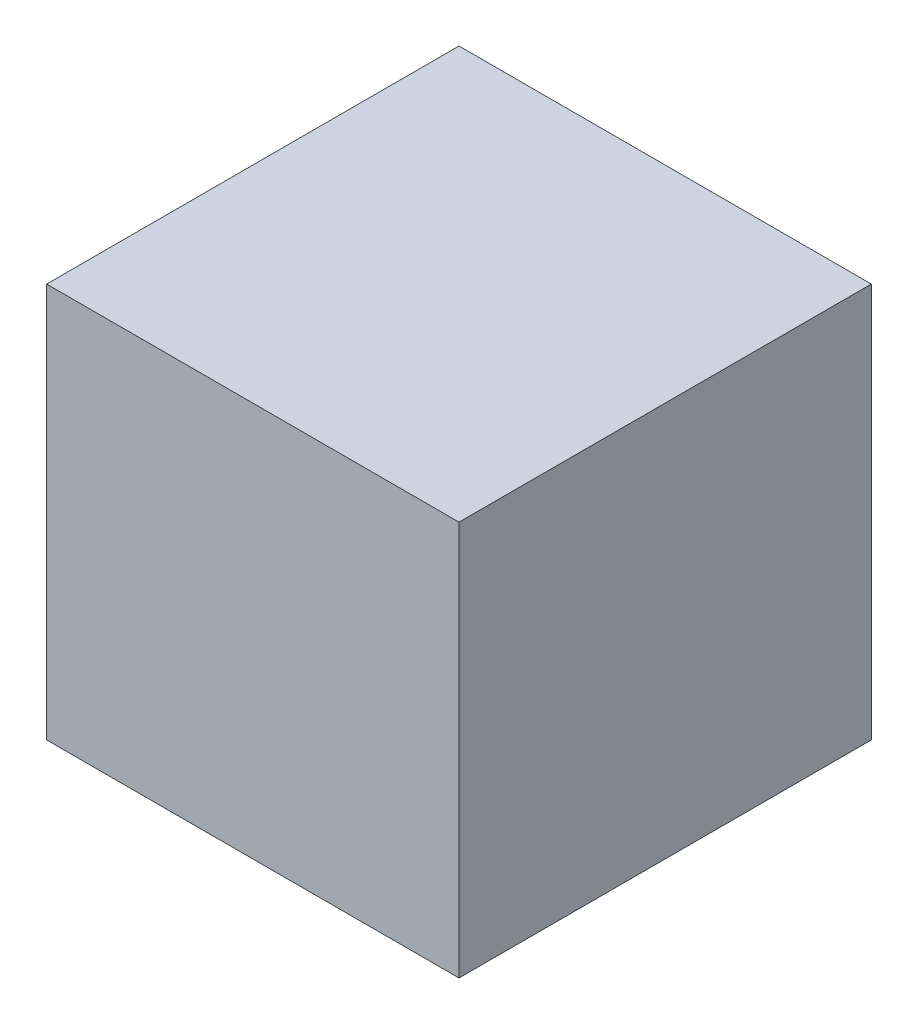
ISO-10303-21;
HEADER;
FILE_DESCRIPTION(('STEP AP214'),'2;1');
FILE_NAME('part.step','',(''),(''),'','','');
FILE_SCHEMA(('AUTOMOTIVE_DESIGN { 1 0 10303 214 1 1 1 1 }'));
ENDSEC;
DATA;
#1=APPLICATION_CONTEXT('core data for automotive mechanical design processes');
#2=APPLICATION_PROTOCOL_DEFINITION('international standard','automotive_design',2000,#1);
#3=PRODUCT_CONTEXT('',#1,'mechanical');
#4=PRODUCT('Part','Part','',(#3));
#5=PRODUCT_RELATED_PRODUCT_CATEGORY('part','',(#4));
#6=PRODUCT_DEFINITION_FORMATION('','',#4);
#7=PRODUCT_DEFINITION_CONTEXT('part definition',#1,'design');
#8=PRODUCT_DEFINITION('design','',#6,#7);
#9=PRODUCT_DEFINITION_SHAPE('','',#8);
#10=(LENGTH_UNIT() NAMED_UNIT(*) SI_UNIT(.MILLI.,.METRE.));
#11=(NAMED_UNIT(*) PLANE_ANGLE_UNIT() SI_UNIT($,.RADIAN.));
#12=(NAMED_UNIT(*) SI_UNIT($,.STERADIAN.) SOLID_ANGLE_UNIT());
#13=UNCERTAINTY_MEASURE_WITH_UNIT(LENGTH_MEASURE(1.E-05),#10,'distance_accuracy_value','');
#14=(GEOMETRIC_REPRESENTATION_CONTEXT(3) GLOBAL_UNCERTAINTY_ASSIGNED_CONTEXT((#13)) GLOBAL_UNIT_ASSIGNED_CONTEXT((#10,
#11,#12)) REPRESENTATION_CONTEXT('',''));
#15=CARTESIAN_POINT('',(0.,0.,0.));
#16=DIRECTION('',(0.,0.,1.));
#17=DIRECTION('',(1.,0.,0.));
#18=AXIS2_PLACEMENT_3D('',#15,#16,#17);
#19=CARTESIAN_POINT('',(47.,90.,-47.));
#20=DIRECTION('',(-1.,0.,0.));
#21=DIRECTION('',(0.,0.,1.));
#22=AXIS2_PLACEMENT_3D('',#19,#20,#21);
#23=PLANE('',#22);
#24=DIRECTION('',(0.,0.,-1.));
#25=VECTOR('',#24,1.);
#26=CARTESIAN_POINT('',(47.,0.,-47.));
#27=LINE('',#26,#25);
#28=CARTESIAN_POINT('',(47.,0.,47.));
#29=VERTEX_POINT('',#28);
#30=CARTESIAN_POINT('',(47.,0.,-47.));
#31=VERTEX_POINT('',#30);
#32=EDGE_CURVE('E96',#29,#31,#27,.T.);
#33=ORIENTED_EDGE('',*,*,#32,.T.);
#34=DIRECTION('',(0.,-1.,0.));
#35=VECTOR('',#34,1.);
#36=CARTESIAN_POINT('',(47.,90.,-47.));
#37=LINE('',#36,#35);
#38=CARTESIAN_POINT('',(47.,90.,-47.));
#39=VERTEX_POINT('',#38);
#40=EDGE_CURVE('E11',#39,#31,#37,.T.);
#41=ORIENTED_EDGE('',*,*,#40,.F.);
#42=DIRECTION('',(0.,0.,-1.));
#43=VECTOR('',#42,1.);
#44=CARTESIAN_POINT('',(47.,90.,-47.));
#45=LINE('',#44,#43);
#46=CARTESIAN_POINT('',(47.,90.,47.));
#47=VERTEX_POINT('',#46);
#48=EDGE_CURVE('E84',#47,#39,#45,.T.);
#49=ORIENTED_EDGE('',*,*,#48,.F.);
#50=DIRECTION('',(0.,-1.,0.));
#51=VECTOR('',#50,1.);
#52=CARTESIAN_POINT('',(47.,90.,47.));
#53=LINE('',#52,#51);
#54=EDGE_CURVE('E92',#47,#29,#53,.T.);
#55=ORIENTED_EDGE('',*,*,#54,.T.);
#56=EDGE_LOOP('',(#33,#41,#49,#55));
#57=FACE_BOUND('',#56,.T.);
#58=ADVANCED_FACE('F33',(#57),#23,.F.);
#59=CARTESIAN_POINT('',(-47.,90.,-47.));
#60=DIRECTION('',(0.,0.,1.));
#61=DIRECTION('',(1.,0.,0.));
#62=AXIS2_PLACEMENT_3D('',#59,#60,#61);
#63=PLANE('',#62);
#64=DIRECTION('',(-1.,0.,0.));
#65=VECTOR('',#64,1.);
#66=CARTESIAN_POINT('',(-47.,0.,-47.));
#67=LINE('',#66,#65);
#68=CARTESIAN_POINT('',(-47.,0.,-47.));
#69=VERTEX_POINT('',#68);
#70=EDGE_CURVE('E88',#31,#69,#67,.T.);
#71=ORIENTED_EDGE('',*,*,#70,.T.);
#72=DIRECTION('',(0.,-1.,0.));
#73=VECTOR('',#72,1.);
#74=CARTESIAN_POINT('',(-47.,90.,-47.));
#75=LINE('',#74,#73);
#76=CARTESIAN_POINT('',(-47.,90.,-47.));
#77=VERTEX_POINT('',#76);
#78=EDGE_CURVE('E41',#77,#69,#75,.T.);
#79=ORIENTED_EDGE('',*,*,#78,.F.);
#80=DIRECTION('',(-1.,0.,0.));
#81=VECTOR('',#80,1.);
#82=CARTESIAN_POINT('',(-47.,90.,-47.));
#83=LINE('',#82,#81);
#84=EDGE_CURVE('E79',#39,#77,#83,.T.);
#85=ORIENTED_EDGE('',*,*,#84,.F.);
#86=ORIENTED_EDGE('',*,*,#40,.T.);
#87=EDGE_LOOP('',(#71,#79,#85,#86));
#88=FACE_BOUND('',#87,.T.);
#89=ADVANCED_FACE('F87',(#88),#63,.F.);
#90=CARTESIAN_POINT('',(-47.,90.,-47.));
#91=DIRECTION('',(1.,0.,0.));
#92=DIRECTION('',(0.,0.,-1.));
#93=AXIS2_PLACEMENT_3D('',#90,#91,#92);
#94=PLANE('',#93);
#95=DIRECTION('',(0.,0.,1.));
#96=VECTOR('',#95,1.);
#97=CARTESIAN_POINT('',(-47.,0.,-47.));
#98=LINE('',#97,#96);
#99=CARTESIAN_POINT('',(-47.,0.,47.));
#100=VERTEX_POINT('',#99);
#101=EDGE_CURVE('E66',#69,#100,#98,.T.);
#102=ORIENTED_EDGE('',*,*,#101,.T.);
#103=DIRECTION('',(0.,-1.,0.));
#104=VECTOR('',#103,1.);
#105=CARTESIAN_POINT('',(-47.,90.,47.));
#106=LINE('',#105,#104);
#107=CARTESIAN_POINT('',(-47.,90.,47.));
#108=VERTEX_POINT('',#107);
#109=EDGE_CURVE('E89',#108,#100,#106,.T.);
#110=ORIENTED_EDGE('',*,*,#109,.F.);
#111=DIRECTION('',(0.,0.,1.));
#112=VECTOR('',#111,1.);
#113=CARTESIAN_POINT('',(-47.,90.,-47.));
#114=LINE('',#113,#112);
#115=EDGE_CURVE('E82',#77,#108,#114,.T.);
#116=ORIENTED_EDGE('',*,*,#115,.F.);
#117=ORIENTED_EDGE('',*,*,#78,.T.);
#118=EDGE_LOOP('',(#102,#110,#116,#117));
#119=FACE_BOUND('',#118,.T.);
#120=ADVANCED_FACE('F90',(#119),#94,.F.);
#121=CARTESIAN_POINT('',(-47.,90.,47.));
#122=DIRECTION('',(0.,0.,-1.));
#123=DIRECTION('',(-1.,0.,0.));
#124=AXIS2_PLACEMENT_3D('',#121,#122,#123);
#125=PLANE('',#124);
#126=DIRECTION('',(1.,0.,0.));
#127=VECTOR('',#126,1.);
#128=CARTESIAN_POINT('',(-47.,0.,47.));
#129=LINE('',#128,#127);
#130=EDGE_CURVE('E72',#100,#29,#129,.T.);
#131=ORIENTED_EDGE('',*,*,#130,.T.);
#132=ORIENTED_EDGE('',*,*,#54,.F.);
#133=DIRECTION('',(1.,0.,0.));
#134=VECTOR('',#133,1.);
#135=CARTESIAN_POINT('',(-47.,90.,47.));
#136=LINE('',#135,#134);
#137=EDGE_CURVE('E49',#108,#47,#136,.T.);
#138=ORIENTED_EDGE('',*,*,#137,.F.);
#139=ORIENTED_EDGE('',*,*,#109,.T.);
#140=EDGE_LOOP('',(#131,#132,#138,#139));
#141=FACE_BOUND('',#140,.T.);
#142=ADVANCED_FACE('F103',(#141),#125,.F.);
#143=CARTESIAN_POINT('',(0.,90.,0.));
#144=DIRECTION('',(0.,1.,0.));
#145=DIRECTION('',(0.,0.,1.));
#146=AXIS2_PLACEMENT_3D('',#143,#144,#145);
#147=PLANE('',#146);
#148=ORIENTED_EDGE('',*,*,#48,.T.);
#149=ORIENTED_EDGE('',*,*,#84,.T.);
#150=ORIENTED_EDGE('',*,*,#115,.T.);
#151=ORIENTED_EDGE('',*,*,#137,.T.);
#152=EDGE_LOOP('',(#148,#149,#150,#151));
#153=FACE_BOUND('',#152,.T.);
#154=ADVANCED_FACE('F80',(#153),#147,.T.);
#155=CARTESIAN_POINT('',(0.,0.,0.));
#156=DIRECTION('',(0.,1.,0.));
#157=DIRECTION('',(0.,0.,1.));
#158=AXIS2_PLACEMENT_3D('',#155,#156,#157);
#159=PLANE('',#158);
#160=ORIENTED_EDGE('',*,*,#32,.F.);
#161=ORIENTED_EDGE('',*,*,#130,.F.);
#162=ORIENTED_EDGE('',*,*,#101,.F.);
#163=ORIENTED_EDGE('',*,*,#70,.F.);
#164=EDGE_LOOP('',(#160,#161,#162,#163));
#165=FACE_BOUND('',#164,.T.);
#166=ADVANCED_FACE('F106',(#165),#159,.F.);
#167=CLOSED_SHELL('',(#58,#89,#120,#142,#154,#166));
#168=MANIFOLD_SOLID_BREP('B2',#167);
#169=ADVANCED_BREP_SHAPE_REPRESENTATION('',(#18,#168),#14);
#170=SHAPE_DEFINITION_REPRESENTATION(#9,#169);
ENDSEC;
END-ISO-10303-21;
